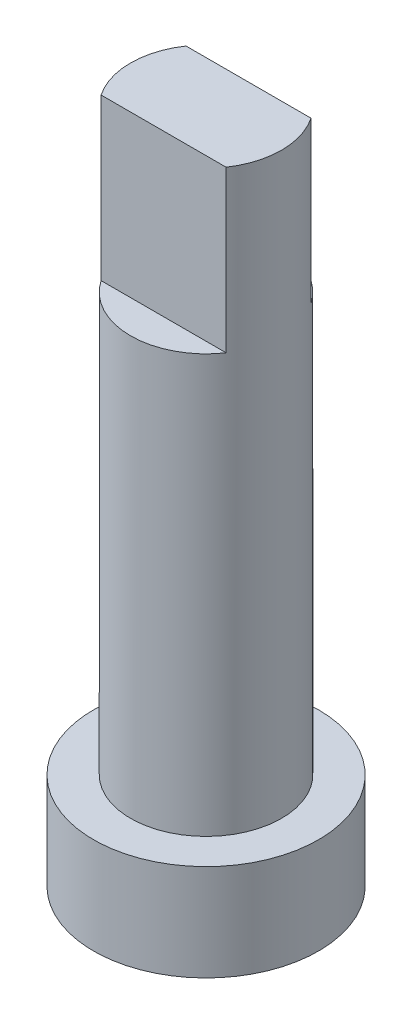
ISO-10303-21;
HEADER;
FILE_DESCRIPTION(('STEP AP214'),'2;1');
FILE_NAME('part.step','',(''),(''),'','','');
FILE_SCHEMA(('AUTOMOTIVE_DESIGN { 1 0 10303 214 1 1 1 1 }'));
ENDSEC;
DATA;
#1=APPLICATION_CONTEXT('core data for automotive mechanical design processes');
#2=APPLICATION_PROTOCOL_DEFINITION('international standard','automotive_design',2000,#1);
#3=PRODUCT_CONTEXT('',#1,'mechanical');
#4=PRODUCT('Part','Part','',(#3));
#5=PRODUCT_RELATED_PRODUCT_CATEGORY('part','',(#4));
#6=PRODUCT_DEFINITION_FORMATION('','',#4);
#7=PRODUCT_DEFINITION_CONTEXT('part definition',#1,'design');
#8=PRODUCT_DEFINITION('design','',#6,#7);
#9=PRODUCT_DEFINITION_SHAPE('','',#8);
#10=(LENGTH_UNIT() NAMED_UNIT(*) SI_UNIT(.MILLI.,.METRE.));
#11=(NAMED_UNIT(*) PLANE_ANGLE_UNIT() SI_UNIT($,.RADIAN.));
#12=(NAMED_UNIT(*) SI_UNIT($,.STERADIAN.) SOLID_ANGLE_UNIT());
#13=UNCERTAINTY_MEASURE_WITH_UNIT(LENGTH_MEASURE(1.E-05),#10,'distance_accuracy_value','');
#14=(GEOMETRIC_REPRESENTATION_CONTEXT(3) GLOBAL_UNCERTAINTY_ASSIGNED_CONTEXT((#13)) GLOBAL_UNIT_ASSIGNED_CONTEXT((#10,
#11,#12)) REPRESENTATION_CONTEXT('',''));
#15=CARTESIAN_POINT('',(0.,0.,0.));
#16=DIRECTION('',(0.,0.,1.));
#17=DIRECTION('',(1.,0.,0.));
#18=AXIS2_PLACEMENT_3D('',#15,#16,#17);
#19=CARTESIAN_POINT('',(0.,18.,0.));
#20=DIRECTION('',(0.,-1.,0.));
#21=DIRECTION('',(0.,0.,-1.));
#22=AXIS2_PLACEMENT_3D('',#19,#20,#21);
#23=CYLINDRICAL_SURFACE('',#22,2.35);
#24=CARTESIAN_POINT('',(0.,18.,0.));
#25=DIRECTION('',(0.,1.,0.));
#26=DIRECTION('',(0.,0.,1.));
#27=AXIS2_PLACEMENT_3D('',#24,#25,#26);
#28=CIRCLE('',#27,2.35);
#29=CARTESIAN_POINT('',(1.9438269728883,18.,1.32061981640134));
#30=VERTEX_POINT('',#29);
#31=CARTESIAN_POINT('',(1.9438269728883,18.,-1.32061981640134));
#32=VERTEX_POINT('',#31);
#33=EDGE_CURVE('E89',#30,#32,#28,.T.);
#34=ORIENTED_EDGE('',*,*,#33,.F.);
#35=DIRECTION('',(0.,-1.,0.));
#36=VECTOR('',#35,1.);
#37=CARTESIAN_POINT('',(1.9438269728883,18.,1.32061981640134));
#38=LINE('',#37,#36);
#39=CARTESIAN_POINT('',(1.9438269728883,13.,1.32061981640134));
#40=VERTEX_POINT('',#39);
#41=EDGE_CURVE('E47',#30,#40,#38,.T.);
#42=ORIENTED_EDGE('',*,*,#41,.T.);
#43=CARTESIAN_POINT('',(0.,13.,0.));
#44=DIRECTION('',(0.,1.,0.));
#45=DIRECTION('',(0.,0.,1.));
#46=AXIS2_PLACEMENT_3D('',#43,#44,#45);
#47=CIRCLE('',#46,2.35);
#48=CARTESIAN_POINT('',(-1.9438269728883,13.,1.32061981640134));
#49=VERTEX_POINT('',#48);
#50=EDGE_CURVE('E11',#49,#40,#47,.T.);
#51=ORIENTED_EDGE('',*,*,#50,.F.);
#52=DIRECTION('',(0.,-1.,0.));
#53=VECTOR('',#52,1.);
#54=CARTESIAN_POINT('',(-1.9438269728883,18.,1.32061981640134));
#55=LINE('',#54,#53);
#56=CARTESIAN_POINT('',(-1.9438269728883,18.,1.32061981640134));
#57=VERTEX_POINT('',#56);
#58=EDGE_CURVE('E74',#49,#57,#55,.F.);
#59=ORIENTED_EDGE('',*,*,#58,.T.);
#60=CARTESIAN_POINT('',(-1.9438269728883,18.,-1.32061981640134));
#61=VERTEX_POINT('',#60);
#62=EDGE_CURVE('E84',#61,#57,#28,.T.);
#63=ORIENTED_EDGE('',*,*,#62,.F.);
#64=DIRECTION('',(0.,-1.,0.));
#65=VECTOR('',#64,1.);
#66=CARTESIAN_POINT('',(-1.9438269728883,18.,-1.32061981640134));
#67=LINE('',#66,#65);
#68=CARTESIAN_POINT('',(-1.9438269728883,13.,-1.32061981640134));
#69=VERTEX_POINT('',#68);
#70=EDGE_CURVE('E55',#61,#69,#67,.T.);
#71=ORIENTED_EDGE('',*,*,#70,.T.);
#72=CARTESIAN_POINT('',(0.,13.,0.));
#73=DIRECTION('',(0.,-1.,0.));
#74=DIRECTION('',(0.,0.,-1.));
#75=AXIS2_PLACEMENT_3D('',#72,#73,#74);
#76=CIRCLE('',#75,2.35);
#77=CARTESIAN_POINT('',(1.9438269728883,13.,-1.32061981640134));
#78=VERTEX_POINT('',#77);
#79=EDGE_CURVE('E79',#69,#78,#76,.T.);
#80=ORIENTED_EDGE('',*,*,#79,.T.);
#81=DIRECTION('',(0.,-1.,0.));
#82=VECTOR('',#81,1.);
#83=CARTESIAN_POINT('',(1.9438269728883,18.,-1.32061981640134));
#84=LINE('',#83,#82);
#85=EDGE_CURVE('E98',#78,#32,#84,.F.);
#86=ORIENTED_EDGE('',*,*,#85,.T.);
#87=EDGE_LOOP('',(#34,#42,#51,#59,#63,#71,#80,#86));
#88=FACE_BOUND('',#87,.T.);
#89=CARTESIAN_POINT('',(0.,0.,0.));
#90=DIRECTION('',(0.,-1.,0.));
#91=DIRECTION('',(0.,0.,-1.));
#92=AXIS2_PLACEMENT_3D('',#89,#90,#91);
#93=CIRCLE('',#92,2.35);
#94=CARTESIAN_POINT('',(0.,0.,-2.35));
#95=VERTEX_POINT('',#94);
#96=EDGE_CURVE('E92',#95,#95,#93,.T.);
#97=ORIENTED_EDGE('',*,*,#96,.F.);
#98=EDGE_LOOP('',(#97));
#99=FACE_BOUND('',#98,.T.);
#100=ADVANCED_FACE('F33',(#88,#99),#23,.T.);
#101=CARTESIAN_POINT('',(0.,18.,0.));
#102=DIRECTION('',(0.,1.,0.));
#103=DIRECTION('',(0.,0.,1.));
#104=AXIS2_PLACEMENT_3D('',#101,#102,#103);
#105=PLANE('',#104);
#106=DIRECTION('',(-1.,0.,0.));
#107=VECTOR('',#106,1.);
#108=CARTESIAN_POINT('',(0.,18.,1.32061981640134));
#109=LINE('',#108,#107);
#110=EDGE_CURVE('E40',#30,#57,#109,.T.);
#111=ORIENTED_EDGE('',*,*,#110,.F.);
#112=ORIENTED_EDGE('',*,*,#33,.T.);
#113=DIRECTION('',(1.,0.,0.));
#114=VECTOR('',#113,1.);
#115=CARTESIAN_POINT('',(0.,18.,-1.32061981640134));
#116=LINE('',#115,#114);
#117=EDGE_CURVE('E88',#61,#32,#116,.T.);
#118=ORIENTED_EDGE('',*,*,#117,.F.);
#119=ORIENTED_EDGE('',*,*,#62,.T.);
#120=EDGE_LOOP('',(#111,#112,#118,#119));
#121=FACE_BOUND('',#120,.T.);
#122=ADVANCED_FACE('F87',(#121),#105,.T.);
#123=CARTESIAN_POINT('',(0.,-3.,0.));
#124=DIRECTION('',(0.,1.,0.));
#125=DIRECTION('',(0.,0.,1.));
#126=AXIS2_PLACEMENT_3D('',#123,#124,#125);
#127=CYLINDRICAL_SURFACE('',#126,3.5);
#128=CARTESIAN_POINT('',(0.,-3.,0.));
#129=DIRECTION('',(0.,-1.,0.));
#130=DIRECTION('',(0.,0.,-1.));
#131=AXIS2_PLACEMENT_3D('',#128,#129,#130);
#132=CIRCLE('',#131,3.5);
#133=CARTESIAN_POINT('',(0.,-3.,-3.5));
#134=VERTEX_POINT('',#133);
#135=EDGE_CURVE('E110',#134,#134,#132,.T.);
#136=ORIENTED_EDGE('',*,*,#135,.F.);
#137=EDGE_LOOP('',(#136));
#138=FACE_BOUND('',#137,.T.);
#139=CARTESIAN_POINT('',(0.,0.,0.));
#140=DIRECTION('',(0.,-1.,0.));
#141=DIRECTION('',(0.,0.,-1.));
#142=AXIS2_PLACEMENT_3D('',#139,#140,#141);
#143=CIRCLE('',#142,3.5);
#144=CARTESIAN_POINT('',(0.,0.,-3.5));
#145=VERTEX_POINT('',#144);
#146=EDGE_CURVE('E109',#145,#145,#143,.T.);
#147=ORIENTED_EDGE('',*,*,#146,.T.);
#148=EDGE_LOOP('',(#147));
#149=FACE_BOUND('',#148,.T.);
#150=ADVANCED_FACE('F115',(#138,#149),#127,.T.);
#151=CARTESIAN_POINT('',(0.,-3.,0.));
#152=DIRECTION('',(0.,-1.,0.));
#153=DIRECTION('',(0.,0.,-1.));
#154=AXIS2_PLACEMENT_3D('',#151,#152,#153);
#155=PLANE('',#154);
#156=ORIENTED_EDGE('',*,*,#135,.T.);
#157=EDGE_LOOP('',(#156));
#158=FACE_BOUND('',#157,.T.);
#159=ADVANCED_FACE('F119',(#158),#155,.T.);
#160=CARTESIAN_POINT('',(0.,0.,0.));
#161=DIRECTION('',(0.,-1.,0.));
#162=DIRECTION('',(0.,0.,-1.));
#163=AXIS2_PLACEMENT_3D('',#160,#161,#162);
#164=PLANE('',#163);
#165=ORIENTED_EDGE('',*,*,#96,.T.);
#166=EDGE_LOOP('',(#165));
#167=FACE_BOUND('',#166,.T.);
#168=ORIENTED_EDGE('',*,*,#146,.F.);
#169=EDGE_LOOP('',(#168));
#170=FACE_BOUND('',#169,.T.);
#171=ADVANCED_FACE('F117',(#167,#170),#164,.F.);
#172=CARTESIAN_POINT('',(0.,13.,0.));
#173=DIRECTION('',(0.,-1.,0.));
#174=DIRECTION('',(0.,0.,-1.));
#175=AXIS2_PLACEMENT_3D('',#172,#173,#174);
#176=PLANE('',#175);
#177=DIRECTION('',(1.,0.,0.));
#178=VECTOR('',#177,1.);
#179=CARTESIAN_POINT('',(1.99637354958509,13.,-1.32061981640134));
#180=LINE('',#179,#178);
#181=EDGE_CURVE('E102',#69,#78,#180,.T.);
#182=ORIENTED_EDGE('',*,*,#181,.T.);
#183=ORIENTED_EDGE('',*,*,#79,.F.);
#184=EDGE_LOOP('',(#182,#183));
#185=FACE_BOUND('',#184,.T.);
#186=ADVANCED_FACE('F101',(#185),#176,.F.);
#187=CARTESIAN_POINT('',(1.99637354958509,13.,-1.32061981640134));
#188=DIRECTION('',(0.,0.,1.));
#189=DIRECTION('',(1.,0.,0.));
#190=AXIS2_PLACEMENT_3D('',#187,#188,#189);
#191=PLANE('',#190);
#192=ORIENTED_EDGE('',*,*,#117,.T.);
#193=ORIENTED_EDGE('',*,*,#85,.F.);
#194=ORIENTED_EDGE('',*,*,#181,.F.);
#195=ORIENTED_EDGE('',*,*,#70,.F.);
#196=EDGE_LOOP('',(#192,#193,#194,#195));
#197=FACE_BOUND('',#196,.T.);
#198=ADVANCED_FACE('F103',(#197),#191,.F.);
#199=CARTESIAN_POINT('',(0.,13.,0.));
#200=DIRECTION('',(0.,1.,0.));
#201=DIRECTION('',(0.,0.,1.));
#202=AXIS2_PLACEMENT_3D('',#199,#200,#201);
#203=PLANE('',#202);
#204=ORIENTED_EDGE('',*,*,#50,.T.);
#205=DIRECTION('',(-1.,0.,0.));
#206=VECTOR('',#205,1.);
#207=CARTESIAN_POINT('',(1.99637354958509,13.,1.32061981640134));
#208=LINE('',#207,#206);
#209=EDGE_CURVE('E85',#40,#49,#208,.T.);
#210=ORIENTED_EDGE('',*,*,#209,.T.);
#211=EDGE_LOOP('',(#204,#210));
#212=FACE_BOUND('',#211,.T.);
#213=ADVANCED_FACE('F173',(#212),#203,.T.);
#214=CARTESIAN_POINT('',(1.99637354958509,13.,1.32061981640134));
#215=DIRECTION('',(0.,0.,-1.));
#216=DIRECTION('',(-1.,0.,0.));
#217=AXIS2_PLACEMENT_3D('',#214,#215,#216);
#218=PLANE('',#217);
#219=ORIENTED_EDGE('',*,*,#110,.T.);
#220=ORIENTED_EDGE('',*,*,#58,.F.);
#221=ORIENTED_EDGE('',*,*,#209,.F.);
#222=ORIENTED_EDGE('',*,*,#41,.F.);
#223=EDGE_LOOP('',(#219,#220,#221,#222));
#224=FACE_BOUND('',#223,.T.);
#225=ADVANCED_FACE('F73',(#224),#218,.F.);
#226=CLOSED_SHELL('',(#100,#122,#150,#159,#171,#186,#198,#213,#225));
#227=MANIFOLD_SOLID_BREP('B2',#226);
#228=ADVANCED_BREP_SHAPE_REPRESENTATION('',(#18,#227),#14);
#229=SHAPE_DEFINITION_REPRESENTATION(#9,#228);
ENDSEC;
END-ISO-10303-21;
